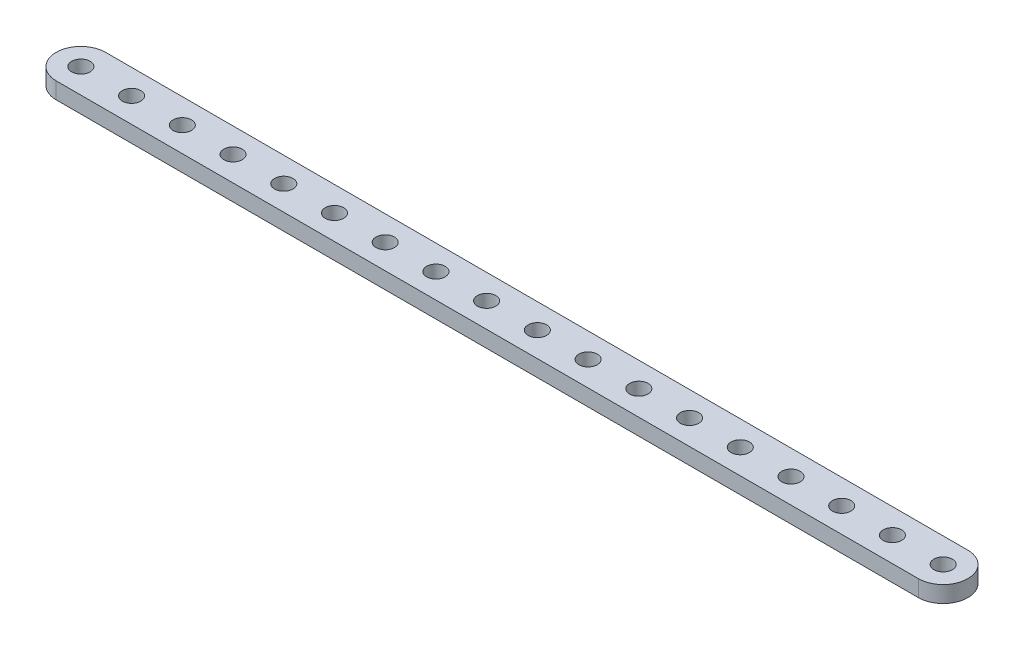
ISO-10303-21;
HEADER;
FILE_DESCRIPTION(('STEP AP214'),'2;1');
FILE_NAME('part.step','',(''),(''),'','','');
FILE_SCHEMA(('AUTOMOTIVE_DESIGN { 1 0 10303 214 1 1 1 1 }'));
ENDSEC;
DATA;
#1=APPLICATION_CONTEXT('core data for automotive mechanical design processes');
#2=APPLICATION_PROTOCOL_DEFINITION('international standard','automotive_design',2000,#1);
#3=PRODUCT_CONTEXT('',#1,'mechanical');
#4=PRODUCT('Part','Part','',(#3));
#5=PRODUCT_RELATED_PRODUCT_CATEGORY('part','',(#4));
#6=PRODUCT_DEFINITION_FORMATION('','',#4);
#7=PRODUCT_DEFINITION_CONTEXT('part definition',#1,'design');
#8=PRODUCT_DEFINITION('design','',#6,#7);
#9=PRODUCT_DEFINITION_SHAPE('','',#8);
#10=(LENGTH_UNIT() NAMED_UNIT(*) SI_UNIT(.MILLI.,.METRE.));
#11=(NAMED_UNIT(*) PLANE_ANGLE_UNIT() SI_UNIT($,.RADIAN.));
#12=(NAMED_UNIT(*) SI_UNIT($,.STERADIAN.) SOLID_ANGLE_UNIT());
#13=UNCERTAINTY_MEASURE_WITH_UNIT(LENGTH_MEASURE(1.E-05),#10,'distance_accuracy_value','');
#14=(GEOMETRIC_REPRESENTATION_CONTEXT(3) GLOBAL_UNCERTAINTY_ASSIGNED_CONTEXT((#13)) GLOBAL_UNIT_ASSIGNED_CONTEXT((#10,
#11,#12)) REPRESENTATION_CONTEXT('',''));
#15=CARTESIAN_POINT('',(0.,0.,0.));
#16=DIRECTION('',(0.,0.,1.));
#17=DIRECTION('',(1.,0.,0.));
#18=AXIS2_PLACEMENT_3D('',#15,#16,#17);
#19=CARTESIAN_POINT('',(-97.79,0.,4.76250000000003));
#20=DIRECTION('',(0.,0.,1.));
#21=DIRECTION('',(1.,0.,0.));
#22=AXIS2_PLACEMENT_3D('',#19,#20,#21);
#23=PLANE('',#22);
#24=DIRECTION('',(1.,0.,0.));
#25=VECTOR('',#24,1.);
#26=CARTESIAN_POINT('',(-97.79,3.175,4.76250000000003));
#27=LINE('',#26,#25);
#28=CARTESIAN_POINT('',(-68.453,3.175,4.76250000000003));
#29=VERTEX_POINT('',#28);
#30=CARTESIAN_POINT('',(97.79,3.175,4.76250000000004));
#31=VERTEX_POINT('',#30);
#32=EDGE_CURVE('E78',#29,#31,#27,.T.);
#33=ORIENTED_EDGE('',*,*,#32,.F.);
#34=DIRECTION('',(0.,1.,0.));
#35=VECTOR('',#34,1.);
#36=CARTESIAN_POINT('',(-68.453,0.,4.76250000000003));
#37=LINE('',#36,#35);
#38=CARTESIAN_POINT('',(-68.453,0.,4.76250000000003));
#39=VERTEX_POINT('',#38);
#40=EDGE_CURVE('E83',#39,#29,#37,.T.);
#41=ORIENTED_EDGE('',*,*,#40,.F.);
#42=DIRECTION('',(1.,0.,0.));
#43=VECTOR('',#42,1.);
#44=CARTESIAN_POINT('',(-97.79,0.,4.76250000000003));
#45=LINE('',#44,#43);
#46=CARTESIAN_POINT('',(97.79,0.,4.76250000000003));
#47=VERTEX_POINT('',#46);
#48=EDGE_CURVE('E58',#39,#47,#45,.T.);
#49=ORIENTED_EDGE('',*,*,#48,.T.);
#50=DIRECTION('',(0.,1.,0.));
#51=VECTOR('',#50,1.);
#52=CARTESIAN_POINT('',(97.79,0.,4.76250000000003));
#53=LINE('',#52,#51);
#54=EDGE_CURVE('E44',#47,#31,#53,.T.);
#55=ORIENTED_EDGE('',*,*,#54,.T.);
#56=EDGE_LOOP('',(#33,#41,#49,#55));
#57=FACE_BOUND('',#56,.T.);
#58=ADVANCED_FACE('F36',(#57),#23,.T.);
#59=CARTESIAN_POINT('',(97.79,0.,0.));
#60=DIRECTION('',(0.,1.,0.));
#61=DIRECTION('',(0.,0.,1.));
#62=AXIS2_PLACEMENT_3D('',#59,#60,#61);
#63=CYLINDRICAL_SURFACE('',#62,4.76250000000002);
#64=CARTESIAN_POINT('',(97.79,3.175,0.));
#65=DIRECTION('',(0.,-1.,0.));
#66=DIRECTION('',(0.,0.,-1.));
#67=AXIS2_PLACEMENT_3D('',#64,#65,#66);
#68=CIRCLE('',#67,4.76250000000002);
#69=CARTESIAN_POINT('',(97.79,3.175,-4.76250000000002));
#70=VERTEX_POINT('',#69);
#71=EDGE_CURVE('E85',#31,#70,#68,.F.);
#72=ORIENTED_EDGE('',*,*,#71,.F.);
#73=ORIENTED_EDGE('',*,*,#54,.F.);
#74=CARTESIAN_POINT('',(97.79,0.,0.));
#75=DIRECTION('',(0.,1.,0.));
#76=DIRECTION('',(0.,0.,1.));
#77=AXIS2_PLACEMENT_3D('',#74,#75,#76);
#78=CIRCLE('',#77,4.76250000000002);
#79=CARTESIAN_POINT('',(97.79,0.,-4.76250000000002));
#80=VERTEX_POINT('',#79);
#81=EDGE_CURVE('E150',#47,#80,#78,.T.);
#82=ORIENTED_EDGE('',*,*,#81,.T.);
#83=DIRECTION('',(0.,1.,0.));
#84=VECTOR('',#83,1.);
#85=CARTESIAN_POINT('',(97.79,0.,-4.76250000000002));
#86=LINE('',#85,#84);
#87=EDGE_CURVE('E157',#80,#70,#86,.T.);
#88=ORIENTED_EDGE('',*,*,#87,.T.);
#89=EDGE_LOOP('',(#72,#73,#82,#88));
#90=FACE_BOUND('',#89,.T.);
#91=ADVANCED_FACE('F38',(#90),#63,.T.);
#92=CARTESIAN_POINT('',(97.79,0.,-4.76250000000002));
#93=DIRECTION('',(0.,0.,-1.));
#94=DIRECTION('',(-1.,0.,0.));
#95=AXIS2_PLACEMENT_3D('',#92,#93,#94);
#96=PLANE('',#95);
#97=DIRECTION('',(-1.,0.,0.));
#98=VECTOR('',#97,1.);
#99=CARTESIAN_POINT('',(97.79,3.175,-4.76250000000002));
#100=LINE('',#99,#98);
#101=CARTESIAN_POINT('',(-68.453,3.175,-4.7625));
#102=VERTEX_POINT('',#101);
#103=EDGE_CURVE('E51',#70,#102,#100,.T.);
#104=ORIENTED_EDGE('',*,*,#103,.F.);
#105=ORIENTED_EDGE('',*,*,#87,.F.);
#106=DIRECTION('',(-1.,0.,0.));
#107=VECTOR('',#106,1.);
#108=CARTESIAN_POINT('',(97.79,0.,-4.76250000000002));
#109=LINE('',#108,#107);
#110=CARTESIAN_POINT('',(-68.453,0.,-4.7625));
#111=VERTEX_POINT('',#110);
#112=EDGE_CURVE('E153',#80,#111,#109,.T.);
#113=ORIENTED_EDGE('',*,*,#112,.T.);
#114=DIRECTION('',(0.,1.,0.));
#115=VECTOR('',#114,1.);
#116=CARTESIAN_POINT('',(-68.453,0.,-4.7625));
#117=LINE('',#116,#115);
#118=EDGE_CURVE('E91',#111,#102,#117,.T.);
#119=ORIENTED_EDGE('',*,*,#118,.T.);
#120=EDGE_LOOP('',(#104,#105,#113,#119));
#121=FACE_BOUND('',#120,.T.);
#122=ADVANCED_FACE('F163',(#121),#96,.T.);
#123=CARTESIAN_POINT('',(97.79,0.,0.));
#124=DIRECTION('',(0.,1.,0.));
#125=DIRECTION('',(0.,0.,1.));
#126=AXIS2_PLACEMENT_3D('',#123,#124,#125);
#127=PLANE('',#126);
#128=CARTESIAN_POINT('',(-68.453,0.,0.));
#129=DIRECTION('',(0.,1.,0.));
#130=DIRECTION('',(0.,0.,-1.));
#131=AXIS2_PLACEMENT_3D('',#128,#129,#130);
#132=CIRCLE('',#131,1.77799999999999);
#133=CARTESIAN_POINT('',(-68.453,0.,-1.77799999999999));
#134=VERTEX_POINT('',#133);
#135=EDGE_CURVE('E90',#134,#134,#132,.T.);
#136=ORIENTED_EDGE('',*,*,#135,.T.);
#137=EDGE_LOOP('',(#136));
#138=FACE_BOUND('',#137,.T.);
#139=CARTESIAN_POINT('',(-58.674,0.,0.));
#140=DIRECTION('',(0.,1.,0.));
#141=DIRECTION('',(0.,0.,-1.));
#142=AXIS2_PLACEMENT_3D('',#139,#140,#141);
#143=CIRCLE('',#142,1.77799999999999);
#144=CARTESIAN_POINT('',(-58.674,0.,-1.77799999999998));
#145=VERTEX_POINT('',#144);
#146=EDGE_CURVE('E94',#145,#145,#143,.T.);
#147=ORIENTED_EDGE('',*,*,#146,.T.);
#148=EDGE_LOOP('',(#147));
#149=FACE_BOUND('',#148,.T.);
#150=CARTESIAN_POINT('',(-48.895,0.,0.));
#151=DIRECTION('',(0.,1.,0.));
#152=DIRECTION('',(0.,0.,-1.));
#153=AXIS2_PLACEMENT_3D('',#150,#151,#152);
#154=CIRCLE('',#153,1.77799999999999);
#155=CARTESIAN_POINT('',(-48.895,0.,-1.77799999999998));
#156=VERTEX_POINT('',#155);
#157=EDGE_CURVE('E102',#156,#156,#154,.T.);
#158=ORIENTED_EDGE('',*,*,#157,.T.);
#159=EDGE_LOOP('',(#158));
#160=FACE_BOUND('',#159,.T.);
#161=CARTESIAN_POINT('',(-39.116,0.,0.));
#162=DIRECTION('',(0.,1.,0.));
#163=DIRECTION('',(0.,0.,-1.));
#164=AXIS2_PLACEMENT_3D('',#161,#162,#163);
#165=CIRCLE('',#164,1.77799999999999);
#166=CARTESIAN_POINT('',(-39.116,0.,-1.77799999999998));
#167=VERTEX_POINT('',#166);
#168=EDGE_CURVE('E105',#167,#167,#165,.T.);
#169=ORIENTED_EDGE('',*,*,#168,.T.);
#170=EDGE_LOOP('',(#169));
#171=FACE_BOUND('',#170,.T.);
#172=CARTESIAN_POINT('',(-29.337,0.,0.));
#173=DIRECTION('',(0.,1.,0.));
#174=DIRECTION('',(0.,0.,-1.));
#175=AXIS2_PLACEMENT_3D('',#172,#173,#174);
#176=CIRCLE('',#175,1.77799999999999);
#177=CARTESIAN_POINT('',(-29.337,0.,-1.77799999999998));
#178=VERTEX_POINT('',#177);
#179=EDGE_CURVE('E108',#178,#178,#176,.T.);
#180=ORIENTED_EDGE('',*,*,#179,.T.);
#181=EDGE_LOOP('',(#180));
#182=FACE_BOUND('',#181,.T.);
#183=CARTESIAN_POINT('',(-19.558,0.,0.));
#184=DIRECTION('',(0.,1.,0.));
#185=DIRECTION('',(0.,0.,-1.));
#186=AXIS2_PLACEMENT_3D('',#183,#184,#185);
#187=CIRCLE('',#186,1.77799999999999);
#188=CARTESIAN_POINT('',(-19.558,0.,-1.77799999999998));
#189=VERTEX_POINT('',#188);
#190=EDGE_CURVE('E111',#189,#189,#187,.T.);
#191=ORIENTED_EDGE('',*,*,#190,.T.);
#192=EDGE_LOOP('',(#191));
#193=FACE_BOUND('',#192,.T.);
#194=CARTESIAN_POINT('',(-9.77900000000001,0.,0.));
#195=DIRECTION('',(0.,1.,0.));
#196=DIRECTION('',(0.,0.,-1.));
#197=AXIS2_PLACEMENT_3D('',#194,#195,#196);
#198=CIRCLE('',#197,1.77799999999999);
#199=CARTESIAN_POINT('',(-9.77900000000001,0.,-1.77799999999998));
#200=VERTEX_POINT('',#199);
#201=EDGE_CURVE('E114',#200,#200,#198,.T.);
#202=ORIENTED_EDGE('',*,*,#201,.T.);
#203=EDGE_LOOP('',(#202));
#204=FACE_BOUND('',#203,.T.);
#205=CARTESIAN_POINT('',(0.,0.,0.));
#206=DIRECTION('',(0.,1.,0.));
#207=DIRECTION('',(0.,0.,-1.));
#208=AXIS2_PLACEMENT_3D('',#205,#206,#207);
#209=CIRCLE('',#208,1.77799999999999);
#210=CARTESIAN_POINT('',(0.,0.,-1.77799999999998));
#211=VERTEX_POINT('',#210);
#212=EDGE_CURVE('E117',#211,#211,#209,.T.);
#213=ORIENTED_EDGE('',*,*,#212,.T.);
#214=EDGE_LOOP('',(#213));
#215=FACE_BOUND('',#214,.T.);
#216=CARTESIAN_POINT('',(9.779,0.,0.));
#217=DIRECTION('',(0.,1.,0.));
#218=DIRECTION('',(0.,0.,-1.));
#219=AXIS2_PLACEMENT_3D('',#216,#217,#218);
#220=CIRCLE('',#219,1.77799999999999);
#221=CARTESIAN_POINT('',(9.779,0.,-1.77799999999998));
#222=VERTEX_POINT('',#221);
#223=EDGE_CURVE('E120',#222,#222,#220,.T.);
#224=ORIENTED_EDGE('',*,*,#223,.T.);
#225=EDGE_LOOP('',(#224));
#226=FACE_BOUND('',#225,.T.);
#227=CARTESIAN_POINT('',(19.558,0.,0.));
#228=DIRECTION('',(0.,1.,0.));
#229=DIRECTION('',(0.,0.,-1.));
#230=AXIS2_PLACEMENT_3D('',#227,#228,#229);
#231=CIRCLE('',#230,1.77799999999999);
#232=CARTESIAN_POINT('',(19.558,0.,-1.77799999999998));
#233=VERTEX_POINT('',#232);
#234=EDGE_CURVE('E123',#233,#233,#231,.T.);
#235=ORIENTED_EDGE('',*,*,#234,.T.);
#236=EDGE_LOOP('',(#235));
#237=FACE_BOUND('',#236,.T.);
#238=CARTESIAN_POINT('',(29.337,0.,0.));
#239=DIRECTION('',(0.,1.,0.));
#240=DIRECTION('',(0.,0.,-1.));
#241=AXIS2_PLACEMENT_3D('',#238,#239,#240);
#242=CIRCLE('',#241,1.77799999999999);
#243=CARTESIAN_POINT('',(29.337,0.,-1.77799999999998));
#244=VERTEX_POINT('',#243);
#245=EDGE_CURVE('E126',#244,#244,#242,.T.);
#246=ORIENTED_EDGE('',*,*,#245,.T.);
#247=EDGE_LOOP('',(#246));
#248=FACE_BOUND('',#247,.T.);
#249=CARTESIAN_POINT('',(39.116,0.,0.));
#250=DIRECTION('',(0.,1.,0.));
#251=DIRECTION('',(0.,0.,-1.));
#252=AXIS2_PLACEMENT_3D('',#249,#250,#251);
#253=CIRCLE('',#252,1.77799999999999);
#254=CARTESIAN_POINT('',(39.116,0.,-1.77799999999998));
#255=VERTEX_POINT('',#254);
#256=EDGE_CURVE('E129',#255,#255,#253,.T.);
#257=ORIENTED_EDGE('',*,*,#256,.T.);
#258=EDGE_LOOP('',(#257));
#259=FACE_BOUND('',#258,.T.);
#260=CARTESIAN_POINT('',(48.895,0.,0.));
#261=DIRECTION('',(0.,1.,0.));
#262=DIRECTION('',(0.,0.,-1.));
#263=AXIS2_PLACEMENT_3D('',#260,#261,#262);
#264=CIRCLE('',#263,1.77799999999999);
#265=CARTESIAN_POINT('',(48.895,0.,-1.77799999999997));
#266=VERTEX_POINT('',#265);
#267=EDGE_CURVE('E132',#266,#266,#264,.T.);
#268=ORIENTED_EDGE('',*,*,#267,.T.);
#269=EDGE_LOOP('',(#268));
#270=FACE_BOUND('',#269,.T.);
#271=CARTESIAN_POINT('',(58.674,0.,0.));
#272=DIRECTION('',(0.,1.,0.));
#273=DIRECTION('',(0.,0.,-1.));
#274=AXIS2_PLACEMENT_3D('',#271,#272,#273);
#275=CIRCLE('',#274,1.77799999999999);
#276=CARTESIAN_POINT('',(58.674,0.,-1.77799999999997));
#277=VERTEX_POINT('',#276);
#278=EDGE_CURVE('E135',#277,#277,#275,.T.);
#279=ORIENTED_EDGE('',*,*,#278,.T.);
#280=EDGE_LOOP('',(#279));
#281=FACE_BOUND('',#280,.T.);
#282=CARTESIAN_POINT('',(68.453,0.,0.));
#283=DIRECTION('',(0.,1.,0.));
#284=DIRECTION('',(0.,0.,-1.));
#285=AXIS2_PLACEMENT_3D('',#282,#283,#284);
#286=CIRCLE('',#285,1.77799999999999);
#287=CARTESIAN_POINT('',(68.453,0.,-1.77799999999997));
#288=VERTEX_POINT('',#287);
#289=EDGE_CURVE('E138',#288,#288,#286,.T.);
#290=ORIENTED_EDGE('',*,*,#289,.T.);
#291=EDGE_LOOP('',(#290));
#292=FACE_BOUND('',#291,.T.);
#293=CARTESIAN_POINT('',(78.232,0.,0.));
#294=DIRECTION('',(0.,1.,0.));
#295=DIRECTION('',(0.,0.,-1.));
#296=AXIS2_PLACEMENT_3D('',#293,#294,#295);
#297=CIRCLE('',#296,1.77799999999999);
#298=CARTESIAN_POINT('',(78.232,0.,-1.77799999999997));
#299=VERTEX_POINT('',#298);
#300=EDGE_CURVE('E141',#299,#299,#297,.T.);
#301=ORIENTED_EDGE('',*,*,#300,.T.);
#302=EDGE_LOOP('',(#301));
#303=FACE_BOUND('',#302,.T.);
#304=CARTESIAN_POINT('',(88.011,0.,0.));
#305=DIRECTION('',(0.,1.,0.));
#306=DIRECTION('',(0.,0.,-1.));
#307=AXIS2_PLACEMENT_3D('',#304,#305,#306);
#308=CIRCLE('',#307,1.77799999999999);
#309=CARTESIAN_POINT('',(88.011,0.,-1.77799999999997));
#310=VERTEX_POINT('',#309);
#311=EDGE_CURVE('E144',#310,#310,#308,.T.);
#312=ORIENTED_EDGE('',*,*,#311,.T.);
#313=EDGE_LOOP('',(#312));
#314=FACE_BOUND('',#313,.T.);
#315=CARTESIAN_POINT('',(97.79,0.,0.));
#316=DIRECTION('',(0.,1.,0.));
#317=DIRECTION('',(0.,0.,-1.));
#318=AXIS2_PLACEMENT_3D('',#315,#316,#317);
#319=CIRCLE('',#318,1.77799999999999);
#320=CARTESIAN_POINT('',(97.79,0.,-1.77799999999997));
#321=VERTEX_POINT('',#320);
#322=EDGE_CURVE('E147',#321,#321,#319,.T.);
#323=ORIENTED_EDGE('',*,*,#322,.T.);
#324=EDGE_LOOP('',(#323));
#325=FACE_BOUND('',#324,.T.);
#326=ORIENTED_EDGE('',*,*,#48,.F.);
#327=CARTESIAN_POINT('',(-68.453,0.,0.));
#328=DIRECTION('',(0.,-1.,0.));
#329=DIRECTION('',(0.,0.,-1.));
#330=AXIS2_PLACEMENT_3D('',#327,#328,#329);
#331=CIRCLE('',#330,4.76250000000002);
#332=EDGE_CURVE('E89',#39,#111,#331,.T.);
#333=ORIENTED_EDGE('',*,*,#332,.T.);
#334=ORIENTED_EDGE('',*,*,#112,.F.);
#335=ORIENTED_EDGE('',*,*,#81,.F.);
#336=EDGE_LOOP('',(#326,#333,#334,#335));
#337=FACE_BOUND('',#336,.T.);
#338=ADVANCED_FACE('F165',(#138,#149,#160,#171,#182,#193,#204,#215,#226,#237,#248,#259,#270,
#281,#292,#303,#314,#325,#337),#127,.F.);
#339=CARTESIAN_POINT('',(97.79,0.,0.));
#340=DIRECTION('',(0.,1.,0.));
#341=DIRECTION('',(0.,0.,1.));
#342=AXIS2_PLACEMENT_3D('',#339,#340,#341);
#343=CYLINDRICAL_SURFACE('',#342,1.77799999999999);
#344=CARTESIAN_POINT('',(97.79,3.175,0.));
#345=DIRECTION('',(0.,-1.,0.));
#346=DIRECTION('',(0.,0.,-1.));
#347=AXIS2_PLACEMENT_3D('',#344,#345,#346);
#348=CIRCLE('',#347,1.77799999999999);
#349=CARTESIAN_POINT('',(97.79,3.175,-1.77799999999997));
#350=VERTEX_POINT('',#349);
#351=EDGE_CURVE('E166',#350,#350,#348,.F.);
#352=ORIENTED_EDGE('',*,*,#351,.T.);
#353=EDGE_LOOP('',(#352));
#354=FACE_BOUND('',#353,.T.);
#355=ORIENTED_EDGE('',*,*,#322,.F.);
#356=EDGE_LOOP('',(#355));
#357=FACE_BOUND('',#356,.T.);
#358=ADVANCED_FACE('F248',(#354,#357),#343,.F.);
#359=CARTESIAN_POINT('',(88.011,0.,0.));
#360=DIRECTION('',(0.,1.,0.));
#361=DIRECTION('',(0.,0.,1.));
#362=AXIS2_PLACEMENT_3D('',#359,#360,#361);
#363=CYLINDRICAL_SURFACE('',#362,1.77799999999999);
#364=CARTESIAN_POINT('',(88.011,3.175,0.));
#365=DIRECTION('',(0.,-1.,0.));
#366=DIRECTION('',(0.,0.,-1.));
#367=AXIS2_PLACEMENT_3D('',#364,#365,#366);
#368=CIRCLE('',#367,1.77799999999999);
#369=CARTESIAN_POINT('',(88.011,3.175,-1.77799999999997));
#370=VERTEX_POINT('',#369);
#371=EDGE_CURVE('E168',#370,#370,#368,.F.);
#372=ORIENTED_EDGE('',*,*,#371,.T.);
#373=EDGE_LOOP('',(#372));
#374=FACE_BOUND('',#373,.T.);
#375=ORIENTED_EDGE('',*,*,#311,.F.);
#376=EDGE_LOOP('',(#375));
#377=FACE_BOUND('',#376,.T.);
#378=ADVANCED_FACE('F252',(#374,#377),#363,.F.);
#379=CARTESIAN_POINT('',(78.232,0.,0.));
#380=DIRECTION('',(0.,1.,0.));
#381=DIRECTION('',(0.,0.,1.));
#382=AXIS2_PLACEMENT_3D('',#379,#380,#381);
#383=CYLINDRICAL_SURFACE('',#382,1.77799999999999);
#384=CARTESIAN_POINT('',(78.232,3.175,0.));
#385=DIRECTION('',(0.,-1.,0.));
#386=DIRECTION('',(0.,0.,-1.));
#387=AXIS2_PLACEMENT_3D('',#384,#385,#386);
#388=CIRCLE('',#387,1.77799999999999);
#389=CARTESIAN_POINT('',(78.232,3.175,-1.77799999999997));
#390=VERTEX_POINT('',#389);
#391=EDGE_CURVE('E172',#390,#390,#388,.F.);
#392=ORIENTED_EDGE('',*,*,#391,.T.);
#393=EDGE_LOOP('',(#392));
#394=FACE_BOUND('',#393,.T.);
#395=ORIENTED_EDGE('',*,*,#300,.F.);
#396=EDGE_LOOP('',(#395));
#397=FACE_BOUND('',#396,.T.);
#398=ADVANCED_FACE('F291',(#394,#397),#383,.F.);
#399=CARTESIAN_POINT('',(68.453,0.,0.));
#400=DIRECTION('',(0.,1.,0.));
#401=DIRECTION('',(0.,0.,1.));
#402=AXIS2_PLACEMENT_3D('',#399,#400,#401);
#403=CYLINDRICAL_SURFACE('',#402,1.77799999999999);
#404=CARTESIAN_POINT('',(68.453,3.175,0.));
#405=DIRECTION('',(0.,-1.,0.));
#406=DIRECTION('',(0.,0.,-1.));
#407=AXIS2_PLACEMENT_3D('',#404,#405,#406);
#408=CIRCLE('',#407,1.77799999999999);
#409=CARTESIAN_POINT('',(68.453,3.175,-1.77799999999997));
#410=VERTEX_POINT('',#409);
#411=EDGE_CURVE('E177',#410,#410,#408,.F.);
#412=ORIENTED_EDGE('',*,*,#411,.T.);
#413=EDGE_LOOP('',(#412));
#414=FACE_BOUND('',#413,.T.);
#415=ORIENTED_EDGE('',*,*,#289,.F.);
#416=EDGE_LOOP('',(#415));
#417=FACE_BOUND('',#416,.T.);
#418=ADVANCED_FACE('F297',(#414,#417),#403,.F.);
#419=CARTESIAN_POINT('',(58.674,0.,0.));
#420=DIRECTION('',(0.,1.,0.));
#421=DIRECTION('',(0.,0.,1.));
#422=AXIS2_PLACEMENT_3D('',#419,#420,#421);
#423=CYLINDRICAL_SURFACE('',#422,1.77799999999999);
#424=CARTESIAN_POINT('',(58.674,3.175,0.));
#425=DIRECTION('',(0.,-1.,0.));
#426=DIRECTION('',(0.,0.,-1.));
#427=AXIS2_PLACEMENT_3D('',#424,#425,#426);
#428=CIRCLE('',#427,1.77799999999999);
#429=CARTESIAN_POINT('',(58.674,3.175,-1.77799999999997));
#430=VERTEX_POINT('',#429);
#431=EDGE_CURVE('E180',#430,#430,#428,.F.);
#432=ORIENTED_EDGE('',*,*,#431,.T.);
#433=EDGE_LOOP('',(#432));
#434=FACE_BOUND('',#433,.T.);
#435=ORIENTED_EDGE('',*,*,#278,.F.);
#436=EDGE_LOOP('',(#435));
#437=FACE_BOUND('',#436,.T.);
#438=ADVANCED_FACE('F303',(#434,#437),#423,.F.);
#439=CARTESIAN_POINT('',(48.895,0.,0.));
#440=DIRECTION('',(0.,1.,0.));
#441=DIRECTION('',(0.,0.,1.));
#442=AXIS2_PLACEMENT_3D('',#439,#440,#441);
#443=CYLINDRICAL_SURFACE('',#442,1.77799999999999);
#444=CARTESIAN_POINT('',(48.895,3.175,0.));
#445=DIRECTION('',(0.,-1.,0.));
#446=DIRECTION('',(0.,0.,-1.));
#447=AXIS2_PLACEMENT_3D('',#444,#445,#446);
#448=CIRCLE('',#447,1.77799999999999);
#449=CARTESIAN_POINT('',(48.895,3.175,-1.77799999999997));
#450=VERTEX_POINT('',#449);
#451=EDGE_CURVE('E183',#450,#450,#448,.F.);
#452=ORIENTED_EDGE('',*,*,#451,.T.);
#453=EDGE_LOOP('',(#452));
#454=FACE_BOUND('',#453,.T.);
#455=ORIENTED_EDGE('',*,*,#267,.F.);
#456=EDGE_LOOP('',(#455));
#457=FACE_BOUND('',#456,.T.);
#458=ADVANCED_FACE('F307',(#454,#457),#443,.F.);
#459=CARTESIAN_POINT('',(39.116,0.,0.));
#460=DIRECTION('',(0.,1.,0.));
#461=DIRECTION('',(0.,0.,1.));
#462=AXIS2_PLACEMENT_3D('',#459,#460,#461);
#463=CYLINDRICAL_SURFACE('',#462,1.77799999999999);
#464=CARTESIAN_POINT('',(39.116,3.175,0.));
#465=DIRECTION('',(0.,-1.,0.));
#466=DIRECTION('',(0.,0.,-1.));
#467=AXIS2_PLACEMENT_3D('',#464,#465,#466);
#468=CIRCLE('',#467,1.77799999999999);
#469=CARTESIAN_POINT('',(39.116,3.175,-1.77799999999998));
#470=VERTEX_POINT('',#469);
#471=EDGE_CURVE('E186',#470,#470,#468,.F.);
#472=ORIENTED_EDGE('',*,*,#471,.T.);
#473=EDGE_LOOP('',(#472));
#474=FACE_BOUND('',#473,.T.);
#475=ORIENTED_EDGE('',*,*,#256,.F.);
#476=EDGE_LOOP('',(#475));
#477=FACE_BOUND('',#476,.T.);
#478=ADVANCED_FACE('F311',(#474,#477),#463,.F.);
#479=CARTESIAN_POINT('',(29.337,0.,0.));
#480=DIRECTION('',(0.,1.,0.));
#481=DIRECTION('',(0.,0.,1.));
#482=AXIS2_PLACEMENT_3D('',#479,#480,#481);
#483=CYLINDRICAL_SURFACE('',#482,1.77799999999999);
#484=CARTESIAN_POINT('',(29.337,3.175,0.));
#485=DIRECTION('',(0.,-1.,0.));
#486=DIRECTION('',(0.,0.,-1.));
#487=AXIS2_PLACEMENT_3D('',#484,#485,#486);
#488=CIRCLE('',#487,1.77799999999999);
#489=CARTESIAN_POINT('',(29.337,3.175,-1.77799999999998));
#490=VERTEX_POINT('',#489);
#491=EDGE_CURVE('E189',#490,#490,#488,.F.);
#492=ORIENTED_EDGE('',*,*,#491,.T.);
#493=EDGE_LOOP('',(#492));
#494=FACE_BOUND('',#493,.T.);
#495=ORIENTED_EDGE('',*,*,#245,.F.);
#496=EDGE_LOOP('',(#495));
#497=FACE_BOUND('',#496,.T.);
#498=ADVANCED_FACE('F315',(#494,#497),#483,.F.);
#499=CARTESIAN_POINT('',(19.558,0.,0.));
#500=DIRECTION('',(0.,1.,0.));
#501=DIRECTION('',(0.,0.,1.));
#502=AXIS2_PLACEMENT_3D('',#499,#500,#501);
#503=CYLINDRICAL_SURFACE('',#502,1.77799999999999);
#504=CARTESIAN_POINT('',(19.558,3.175,0.));
#505=DIRECTION('',(0.,-1.,0.));
#506=DIRECTION('',(0.,0.,-1.));
#507=AXIS2_PLACEMENT_3D('',#504,#505,#506);
#508=CIRCLE('',#507,1.77799999999999);
#509=CARTESIAN_POINT('',(19.558,3.175,-1.77799999999998));
#510=VERTEX_POINT('',#509);
#511=EDGE_CURVE('E192',#510,#510,#508,.F.);
#512=ORIENTED_EDGE('',*,*,#511,.T.);
#513=EDGE_LOOP('',(#512));
#514=FACE_BOUND('',#513,.T.);
#515=ORIENTED_EDGE('',*,*,#234,.F.);
#516=EDGE_LOOP('',(#515));
#517=FACE_BOUND('',#516,.T.);
#518=ADVANCED_FACE('F319',(#514,#517),#503,.F.);
#519=CARTESIAN_POINT('',(9.779,0.,0.));
#520=DIRECTION('',(0.,1.,0.));
#521=DIRECTION('',(0.,0.,1.));
#522=AXIS2_PLACEMENT_3D('',#519,#520,#521);
#523=CYLINDRICAL_SURFACE('',#522,1.77799999999999);
#524=CARTESIAN_POINT('',(9.779,3.175,0.));
#525=DIRECTION('',(0.,-1.,0.));
#526=DIRECTION('',(0.,0.,-1.));
#527=AXIS2_PLACEMENT_3D('',#524,#525,#526);
#528=CIRCLE('',#527,1.77799999999999);
#529=CARTESIAN_POINT('',(9.779,3.175,-1.77799999999998));
#530=VERTEX_POINT('',#529);
#531=EDGE_CURVE('E195',#530,#530,#528,.F.);
#532=ORIENTED_EDGE('',*,*,#531,.T.);
#533=EDGE_LOOP('',(#532));
#534=FACE_BOUND('',#533,.T.);
#535=ORIENTED_EDGE('',*,*,#223,.F.);
#536=EDGE_LOOP('',(#535));
#537=FACE_BOUND('',#536,.T.);
#538=ADVANCED_FACE('F323',(#534,#537),#523,.F.);
#539=CARTESIAN_POINT('',(0.,0.,0.));
#540=DIRECTION('',(0.,1.,0.));
#541=DIRECTION('',(0.,0.,1.));
#542=AXIS2_PLACEMENT_3D('',#539,#540,#541);
#543=CYLINDRICAL_SURFACE('',#542,1.77799999999999);
#544=CARTESIAN_POINT('',(0.,3.175,0.));
#545=DIRECTION('',(0.,-1.,0.));
#546=DIRECTION('',(0.,0.,-1.));
#547=AXIS2_PLACEMENT_3D('',#544,#545,#546);
#548=CIRCLE('',#547,1.77799999999999);
#549=CARTESIAN_POINT('',(0.,3.175,-1.77799999999998));
#550=VERTEX_POINT('',#549);
#551=EDGE_CURVE('E198',#550,#550,#548,.F.);
#552=ORIENTED_EDGE('',*,*,#551,.T.);
#553=EDGE_LOOP('',(#552));
#554=FACE_BOUND('',#553,.T.);
#555=ORIENTED_EDGE('',*,*,#212,.F.);
#556=EDGE_LOOP('',(#555));
#557=FACE_BOUND('',#556,.T.);
#558=ADVANCED_FACE('F327',(#554,#557),#543,.F.);
#559=CARTESIAN_POINT('',(-9.77900000000001,0.,0.));
#560=DIRECTION('',(0.,1.,0.));
#561=DIRECTION('',(0.,0.,1.));
#562=AXIS2_PLACEMENT_3D('',#559,#560,#561);
#563=CYLINDRICAL_SURFACE('',#562,1.77799999999999);
#564=CARTESIAN_POINT('',(-9.77900000000001,3.175,0.));
#565=DIRECTION('',(0.,-1.,0.));
#566=DIRECTION('',(0.,0.,-1.));
#567=AXIS2_PLACEMENT_3D('',#564,#565,#566);
#568=CIRCLE('',#567,1.77799999999999);
#569=CARTESIAN_POINT('',(-9.77900000000001,3.175,-1.77799999999998));
#570=VERTEX_POINT('',#569);
#571=EDGE_CURVE('E201',#570,#570,#568,.F.);
#572=ORIENTED_EDGE('',*,*,#571,.T.);
#573=EDGE_LOOP('',(#572));
#574=FACE_BOUND('',#573,.T.);
#575=ORIENTED_EDGE('',*,*,#201,.F.);
#576=EDGE_LOOP('',(#575));
#577=FACE_BOUND('',#576,.T.);
#578=ADVANCED_FACE('F331',(#574,#577),#563,.F.);
#579=CARTESIAN_POINT('',(-19.558,0.,0.));
#580=DIRECTION('',(0.,1.,0.));
#581=DIRECTION('',(0.,0.,1.));
#582=AXIS2_PLACEMENT_3D('',#579,#580,#581);
#583=CYLINDRICAL_SURFACE('',#582,1.77799999999999);
#584=CARTESIAN_POINT('',(-19.558,3.175,0.));
#585=DIRECTION('',(0.,-1.,0.));
#586=DIRECTION('',(0.,0.,-1.));
#587=AXIS2_PLACEMENT_3D('',#584,#585,#586);
#588=CIRCLE('',#587,1.77799999999999);
#589=CARTESIAN_POINT('',(-19.558,3.175,-1.77799999999998));
#590=VERTEX_POINT('',#589);
#591=EDGE_CURVE('E204',#590,#590,#588,.F.);
#592=ORIENTED_EDGE('',*,*,#591,.T.);
#593=EDGE_LOOP('',(#592));
#594=FACE_BOUND('',#593,.T.);
#595=ORIENTED_EDGE('',*,*,#190,.F.);
#596=EDGE_LOOP('',(#595));
#597=FACE_BOUND('',#596,.T.);
#598=ADVANCED_FACE('F335',(#594,#597),#583,.F.);
#599=CARTESIAN_POINT('',(-29.337,0.,0.));
#600=DIRECTION('',(0.,1.,0.));
#601=DIRECTION('',(0.,0.,1.));
#602=AXIS2_PLACEMENT_3D('',#599,#600,#601);
#603=CYLINDRICAL_SURFACE('',#602,1.77799999999999);
#604=CARTESIAN_POINT('',(-29.337,3.175,0.));
#605=DIRECTION('',(0.,-1.,0.));
#606=DIRECTION('',(0.,0.,-1.));
#607=AXIS2_PLACEMENT_3D('',#604,#605,#606);
#608=CIRCLE('',#607,1.77799999999999);
#609=CARTESIAN_POINT('',(-29.337,3.175,-1.77799999999998));
#610=VERTEX_POINT('',#609);
#611=EDGE_CURVE('E207',#610,#610,#608,.F.);
#612=ORIENTED_EDGE('',*,*,#611,.T.);
#613=EDGE_LOOP('',(#612));
#614=FACE_BOUND('',#613,.T.);
#615=ORIENTED_EDGE('',*,*,#179,.F.);
#616=EDGE_LOOP('',(#615));
#617=FACE_BOUND('',#616,.T.);
#618=ADVANCED_FACE('F339',(#614,#617),#603,.F.);
#619=CARTESIAN_POINT('',(-39.116,0.,0.));
#620=DIRECTION('',(0.,1.,0.));
#621=DIRECTION('',(0.,0.,1.));
#622=AXIS2_PLACEMENT_3D('',#619,#620,#621);
#623=CYLINDRICAL_SURFACE('',#622,1.77799999999999);
#624=CARTESIAN_POINT('',(-39.116,3.175,0.));
#625=DIRECTION('',(0.,-1.,0.));
#626=DIRECTION('',(0.,0.,-1.));
#627=AXIS2_PLACEMENT_3D('',#624,#625,#626);
#628=CIRCLE('',#627,1.77799999999999);
#629=CARTESIAN_POINT('',(-39.116,3.175,-1.77799999999998));
#630=VERTEX_POINT('',#629);
#631=EDGE_CURVE('E210',#630,#630,#628,.F.);
#632=ORIENTED_EDGE('',*,*,#631,.T.);
#633=EDGE_LOOP('',(#632));
#634=FACE_BOUND('',#633,.T.);
#635=ORIENTED_EDGE('',*,*,#168,.F.);
#636=EDGE_LOOP('',(#635));
#637=FACE_BOUND('',#636,.T.);
#638=ADVANCED_FACE('F343',(#634,#637),#623,.F.);
#639=CARTESIAN_POINT('',(-48.895,0.,0.));
#640=DIRECTION('',(0.,1.,0.));
#641=DIRECTION('',(0.,0.,1.));
#642=AXIS2_PLACEMENT_3D('',#639,#640,#641);
#643=CYLINDRICAL_SURFACE('',#642,1.77799999999999);
#644=CARTESIAN_POINT('',(-48.895,3.175,0.));
#645=DIRECTION('',(0.,-1.,0.));
#646=DIRECTION('',(0.,0.,-1.));
#647=AXIS2_PLACEMENT_3D('',#644,#645,#646);
#648=CIRCLE('',#647,1.77799999999999);
#649=CARTESIAN_POINT('',(-48.895,3.175,-1.77799999999998));
#650=VERTEX_POINT('',#649);
#651=EDGE_CURVE('E213',#650,#650,#648,.F.);
#652=ORIENTED_EDGE('',*,*,#651,.T.);
#653=EDGE_LOOP('',(#652));
#654=FACE_BOUND('',#653,.T.);
#655=ORIENTED_EDGE('',*,*,#157,.F.);
#656=EDGE_LOOP('',(#655));
#657=FACE_BOUND('',#656,.T.);
#658=ADVANCED_FACE('F347',(#654,#657),#643,.F.);
#659=CARTESIAN_POINT('',(-58.674,0.,0.));
#660=DIRECTION('',(0.,1.,0.));
#661=DIRECTION('',(0.,0.,1.));
#662=AXIS2_PLACEMENT_3D('',#659,#660,#661);
#663=CYLINDRICAL_SURFACE('',#662,1.77799999999999);
#664=CARTESIAN_POINT('',(-58.674,3.175,0.));
#665=DIRECTION('',(0.,-1.,0.));
#666=DIRECTION('',(0.,0.,-1.));
#667=AXIS2_PLACEMENT_3D('',#664,#665,#666);
#668=CIRCLE('',#667,1.77799999999999);
#669=CARTESIAN_POINT('',(-58.674,3.175,-1.77799999999998));
#670=VERTEX_POINT('',#669);
#671=EDGE_CURVE('E216',#670,#670,#668,.F.);
#672=ORIENTED_EDGE('',*,*,#671,.T.);
#673=EDGE_LOOP('',(#672));
#674=FACE_BOUND('',#673,.T.);
#675=ORIENTED_EDGE('',*,*,#146,.F.);
#676=EDGE_LOOP('',(#675));
#677=FACE_BOUND('',#676,.T.);
#678=ADVANCED_FACE('F351',(#674,#677),#663,.F.);
#679=CARTESIAN_POINT('',(-68.453,0.,0.));
#680=DIRECTION('',(0.,1.,0.));
#681=DIRECTION('',(0.,0.,1.));
#682=AXIS2_PLACEMENT_3D('',#679,#680,#681);
#683=CYLINDRICAL_SURFACE('',#682,1.77799999999999);
#684=CARTESIAN_POINT('',(-68.453,3.175,0.));
#685=DIRECTION('',(0.,-1.,0.));
#686=DIRECTION('',(0.,0.,-1.));
#687=AXIS2_PLACEMENT_3D('',#684,#685,#686);
#688=CIRCLE('',#687,1.77799999999999);
#689=CARTESIAN_POINT('',(-68.453,3.175,-1.77799999999999));
#690=VERTEX_POINT('',#689);
#691=EDGE_CURVE('E84',#690,#690,#688,.F.);
#692=ORIENTED_EDGE('',*,*,#691,.T.);
#693=EDGE_LOOP('',(#692));
#694=FACE_BOUND('',#693,.T.);
#695=ORIENTED_EDGE('',*,*,#135,.F.);
#696=EDGE_LOOP('',(#695));
#697=FACE_BOUND('',#696,.T.);
#698=ADVANCED_FACE('F224',(#694,#697),#683,.F.);
#699=CARTESIAN_POINT('',(-68.453,0.,0.));
#700=DIRECTION('',(0.,1.,0.));
#701=DIRECTION('',(0.,0.,1.));
#702=AXIS2_PLACEMENT_3D('',#699,#700,#701);
#703=CYLINDRICAL_SURFACE('',#702,4.76250000000002);
#704=ORIENTED_EDGE('',*,*,#40,.T.);
#705=CARTESIAN_POINT('',(-68.453,3.175,0.));
#706=DIRECTION('',(0.,-1.,0.));
#707=DIRECTION('',(0.,0.,-1.));
#708=AXIS2_PLACEMENT_3D('',#705,#706,#707);
#709=CIRCLE('',#708,4.76250000000002);
#710=EDGE_CURVE('E11',#29,#102,#709,.T.);
#711=ORIENTED_EDGE('',*,*,#710,.T.);
#712=ORIENTED_EDGE('',*,*,#118,.F.);
#713=ORIENTED_EDGE('',*,*,#332,.F.);
#714=EDGE_LOOP('',(#704,#711,#712,#713));
#715=FACE_BOUND('',#714,.T.);
#716=ADVANCED_FACE('F87',(#715),#703,.T.);
#717=CARTESIAN_POINT('',(0.,3.175,0.));
#718=DIRECTION('',(0.,-1.,0.));
#719=DIRECTION('',(0.,0.,-1.));
#720=AXIS2_PLACEMENT_3D('',#717,#718,#719);
#721=PLANE('',#720);
#722=ORIENTED_EDGE('',*,*,#371,.F.);
#723=EDGE_LOOP('',(#722));
#724=FACE_BOUND('',#723,.T.);
#725=ORIENTED_EDGE('',*,*,#411,.F.);
#726=EDGE_LOOP('',(#725));
#727=FACE_BOUND('',#726,.T.);
#728=ORIENTED_EDGE('',*,*,#451,.F.);
#729=EDGE_LOOP('',(#728));
#730=FACE_BOUND('',#729,.T.);
#731=ORIENTED_EDGE('',*,*,#491,.F.);
#732=EDGE_LOOP('',(#731));
#733=FACE_BOUND('',#732,.T.);
#734=ORIENTED_EDGE('',*,*,#531,.F.);
#735=EDGE_LOOP('',(#734));
#736=FACE_BOUND('',#735,.T.);
#737=ORIENTED_EDGE('',*,*,#571,.F.);
#738=EDGE_LOOP('',(#737));
#739=FACE_BOUND('',#738,.T.);
#740=ORIENTED_EDGE('',*,*,#611,.F.);
#741=EDGE_LOOP('',(#740));
#742=FACE_BOUND('',#741,.T.);
#743=ORIENTED_EDGE('',*,*,#651,.F.);
#744=EDGE_LOOP('',(#743));
#745=FACE_BOUND('',#744,.T.);
#746=ORIENTED_EDGE('',*,*,#691,.F.);
#747=EDGE_LOOP('',(#746));
#748=FACE_BOUND('',#747,.T.);
#749=ORIENTED_EDGE('',*,*,#32,.T.);
#750=ORIENTED_EDGE('',*,*,#71,.T.);
#751=ORIENTED_EDGE('',*,*,#103,.T.);
#752=ORIENTED_EDGE('',*,*,#710,.F.);
#753=EDGE_LOOP('',(#749,#750,#751,#752));
#754=FACE_BOUND('',#753,.T.);
#755=ORIENTED_EDGE('',*,*,#671,.F.);
#756=EDGE_LOOP('',(#755));
#757=FACE_BOUND('',#756,.T.);
#758=ORIENTED_EDGE('',*,*,#631,.F.);
#759=EDGE_LOOP('',(#758));
#760=FACE_BOUND('',#759,.T.);
#761=ORIENTED_EDGE('',*,*,#591,.F.);
#762=EDGE_LOOP('',(#761));
#763=FACE_BOUND('',#762,.T.);
#764=ORIENTED_EDGE('',*,*,#551,.F.);
#765=EDGE_LOOP('',(#764));
#766=FACE_BOUND('',#765,.T.);
#767=ORIENTED_EDGE('',*,*,#511,.F.);
#768=EDGE_LOOP('',(#767));
#769=FACE_BOUND('',#768,.T.);
#770=ORIENTED_EDGE('',*,*,#471,.F.);
#771=EDGE_LOOP('',(#770));
#772=FACE_BOUND('',#771,.T.);
#773=ORIENTED_EDGE('',*,*,#431,.F.);
#774=EDGE_LOOP('',(#773));
#775=FACE_BOUND('',#774,.T.);
#776=ORIENTED_EDGE('',*,*,#391,.F.);
#777=EDGE_LOOP('',(#776));
#778=FACE_BOUND('',#777,.T.);
#779=ORIENTED_EDGE('',*,*,#351,.F.);
#780=EDGE_LOOP('',(#779));
#781=FACE_BOUND('',#780,.T.);
#782=ADVANCED_FACE('F76',(#724,#727,#730,#733,#736,#739,#742,#745,#748,#754,#757,#760,#763,#766,
#769,#772,#775,#778,#781),#721,.F.);
#783=CLOSED_SHELL('',(#58,#91,#122,#338,#358,#378,#398,#418,#438,#458,#478,#498,#518,#538,#558,
#578,#598,#618,#638,#658,#678,#698,#716,#782));
#784=MANIFOLD_SOLID_BREP('B2',#783);
#785=ADVANCED_BREP_SHAPE_REPRESENTATION('',(#18,#784),#14);
#786=SHAPE_DEFINITION_REPRESENTATION(#9,#785);
ENDSEC;
END-ISO-10303-21;
